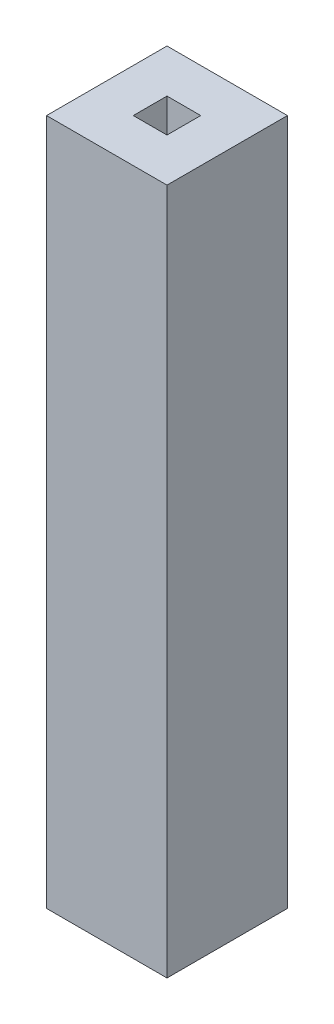
ISO-10303-21;
HEADER;
FILE_DESCRIPTION(('STEP AP214'),'2;1');
FILE_NAME('part.step','',(''),(''),'','','');
FILE_SCHEMA(('AUTOMOTIVE_DESIGN { 1 0 10303 214 1 1 1 1 }'));
ENDSEC;
DATA;
#1=APPLICATION_CONTEXT('core data for automotive mechanical design processes');
#2=APPLICATION_PROTOCOL_DEFINITION('international standard','automotive_design',2000,#1);
#3=PRODUCT_CONTEXT('',#1,'mechanical');
#4=PRODUCT('Part','Part','',(#3));
#5=PRODUCT_RELATED_PRODUCT_CATEGORY('part','',(#4));
#6=PRODUCT_DEFINITION_FORMATION('','',#4);
#7=PRODUCT_DEFINITION_CONTEXT('part definition',#1,'design');
#8=PRODUCT_DEFINITION('design','',#6,#7);
#9=PRODUCT_DEFINITION_SHAPE('','',#8);
#10=(LENGTH_UNIT() NAMED_UNIT(*) SI_UNIT(.MILLI.,.METRE.));
#11=(NAMED_UNIT(*) PLANE_ANGLE_UNIT() SI_UNIT($,.RADIAN.));
#12=(NAMED_UNIT(*) SI_UNIT($,.STERADIAN.) SOLID_ANGLE_UNIT());
#13=UNCERTAINTY_MEASURE_WITH_UNIT(LENGTH_MEASURE(1.E-05),#10,'distance_accuracy_value','');
#14=(GEOMETRIC_REPRESENTATION_CONTEXT(3) GLOBAL_UNCERTAINTY_ASSIGNED_CONTEXT((#13)) GLOBAL_UNIT_ASSIGNED_CONTEXT((#10,
#11,#12)) REPRESENTATION_CONTEXT('',''));
#15=CARTESIAN_POINT('',(0.,0.,0.));
#16=DIRECTION('',(0.,0.,1.));
#17=DIRECTION('',(1.,0.,0.));
#18=AXIS2_PLACEMENT_3D('',#15,#16,#17);
#19=CARTESIAN_POINT('',(0.,14.25,0.));
#20=DIRECTION('',(0.,1.,0.));
#21=DIRECTION('',(0.,0.,1.));
#22=AXIS2_PLACEMENT_3D('',#19,#20,#21);
#23=PLANE('',#22);
#24=DIRECTION('',(0.,0.,-1.));
#25=VECTOR('',#24,1.);
#26=CARTESIAN_POINT('',(1.25,14.25,-1.25));
#27=LINE('',#26,#25);
#28=CARTESIAN_POINT('',(1.25,14.25,1.25));
#29=VERTEX_POINT('',#28);
#30=CARTESIAN_POINT('',(1.25,14.25,-1.25));
#31=VERTEX_POINT('',#30);
#32=EDGE_CURVE('E158',#29,#31,#27,.T.);
#33=ORIENTED_EDGE('',*,*,#32,.T.);
#34=DIRECTION('',(-1.,0.,0.));
#35=VECTOR('',#34,1.);
#36=CARTESIAN_POINT('',(-1.25,14.25,-1.25));
#37=LINE('',#36,#35);
#38=CARTESIAN_POINT('',(-1.25,14.25,-1.25));
#39=VERTEX_POINT('',#38);
#40=EDGE_CURVE('E161',#31,#39,#37,.T.);
#41=ORIENTED_EDGE('',*,*,#40,.T.);
#42=DIRECTION('',(0.,0.,1.));
#43=VECTOR('',#42,1.);
#44=CARTESIAN_POINT('',(-1.25,14.25,-1.25));
#45=LINE('',#44,#43);
#46=CARTESIAN_POINT('',(-1.25,14.25,1.25));
#47=VERTEX_POINT('',#46);
#48=EDGE_CURVE('E164',#39,#47,#45,.T.);
#49=ORIENTED_EDGE('',*,*,#48,.T.);
#50=DIRECTION('',(1.,0.,0.));
#51=VECTOR('',#50,1.);
#52=CARTESIAN_POINT('',(-1.25,14.25,1.25));
#53=LINE('',#52,#51);
#54=EDGE_CURVE('E166',#47,#29,#53,.T.);
#55=ORIENTED_EDGE('',*,*,#54,.T.);
#56=EDGE_LOOP('',(#33,#41,#49,#55));
#57=FACE_BOUND('',#56,.T.);
#58=DIRECTION('',(-1.,0.,0.));
#59=VECTOR('',#58,1.);
#60=CARTESIAN_POINT('',(-1.25,14.25,-0.350000000000001));
#61=LINE('',#60,#59);
#62=CARTESIAN_POINT('',(0.35,14.25,-0.350000000000001));
#63=VERTEX_POINT('',#62);
#64=CARTESIAN_POINT('',(-0.35,14.25,-0.350000000000001));
#65=VERTEX_POINT('',#64);
#66=EDGE_CURVE('E130',#63,#65,#61,.T.);
#67=ORIENTED_EDGE('',*,*,#66,.F.);
#68=DIRECTION('',(0.,0.,-1.));
#69=VECTOR('',#68,1.);
#70=CARTESIAN_POINT('',(0.35,14.25,-1.25));
#71=LINE('',#70,#69);
#72=CARTESIAN_POINT('',(0.35,14.25,0.349999999999999));
#73=VERTEX_POINT('',#72);
#74=EDGE_CURVE('E122',#73,#63,#71,.T.);
#75=ORIENTED_EDGE('',*,*,#74,.F.);
#76=DIRECTION('',(1.,0.,0.));
#77=VECTOR('',#76,1.);
#78=CARTESIAN_POINT('',(-1.25,14.25,0.349999999999999));
#79=LINE('',#78,#77);
#80=CARTESIAN_POINT('',(-0.35,14.25,0.349999999999999));
#81=VERTEX_POINT('',#80);
#82=EDGE_CURVE('E144',#81,#73,#79,.T.);
#83=ORIENTED_EDGE('',*,*,#82,.F.);
#84=DIRECTION('',(0.,0.,1.));
#85=VECTOR('',#84,1.);
#86=CARTESIAN_POINT('',(-0.35,14.25,-1.25));
#87=LINE('',#86,#85);
#88=EDGE_CURVE('E142',#65,#81,#87,.T.);
#89=ORIENTED_EDGE('',*,*,#88,.F.);
#90=EDGE_LOOP('',(#67,#75,#83,#89));
#91=FACE_BOUND('',#90,.T.);
#92=ADVANCED_FACE('F57',(#57,#91),#23,.T.);
#93=CARTESIAN_POINT('',(0.,0.,0.));
#94=DIRECTION('',(0.,1.,0.));
#95=DIRECTION('',(0.,0.,1.));
#96=AXIS2_PLACEMENT_3D('',#93,#94,#95);
#97=PLANE('',#96);
#98=DIRECTION('',(0.,0.,-1.));
#99=VECTOR('',#98,1.);
#100=CARTESIAN_POINT('',(1.25,0.,-1.25));
#101=LINE('',#100,#99);
#102=CARTESIAN_POINT('',(1.25,0.,1.25));
#103=VERTEX_POINT('',#102);
#104=CARTESIAN_POINT('',(1.25,0.,-1.25));
#105=VERTEX_POINT('',#104);
#106=EDGE_CURVE('E138',#103,#105,#101,.T.);
#107=ORIENTED_EDGE('',*,*,#106,.F.);
#108=DIRECTION('',(1.,0.,0.));
#109=VECTOR('',#108,1.);
#110=CARTESIAN_POINT('',(-1.25,0.,1.25));
#111=LINE('',#110,#109);
#112=CARTESIAN_POINT('',(-1.25,0.,1.25));
#113=VERTEX_POINT('',#112);
#114=EDGE_CURVE('E162',#113,#103,#111,.T.);
#115=ORIENTED_EDGE('',*,*,#114,.F.);
#116=DIRECTION('',(0.,0.,1.));
#117=VECTOR('',#116,1.);
#118=CARTESIAN_POINT('',(-1.25,0.,-1.25));
#119=LINE('',#118,#117);
#120=CARTESIAN_POINT('',(-1.25,0.,-1.25));
#121=VERTEX_POINT('',#120);
#122=EDGE_CURVE('E173',#121,#113,#119,.T.);
#123=ORIENTED_EDGE('',*,*,#122,.F.);
#124=DIRECTION('',(-1.,0.,0.));
#125=VECTOR('',#124,1.);
#126=CARTESIAN_POINT('',(-1.25,0.,-1.25));
#127=LINE('',#126,#125);
#128=EDGE_CURVE('E171',#105,#121,#127,.T.);
#129=ORIENTED_EDGE('',*,*,#128,.F.);
#130=EDGE_LOOP('',(#107,#115,#123,#129));
#131=FACE_BOUND('',#130,.T.);
#132=DIRECTION('',(0.,0.,-1.));
#133=VECTOR('',#132,1.);
#134=CARTESIAN_POINT('',(0.35,0.,-1.25));
#135=LINE('',#134,#133);
#136=CARTESIAN_POINT('',(0.35,0.,0.349999999999999));
#137=VERTEX_POINT('',#136);
#138=CARTESIAN_POINT('',(0.35,0.,-0.350000000000001));
#139=VERTEX_POINT('',#138);
#140=EDGE_CURVE('E80',#137,#139,#135,.T.);
#141=ORIENTED_EDGE('',*,*,#140,.T.);
#142=DIRECTION('',(-1.,0.,0.));
#143=VECTOR('',#142,1.);
#144=CARTESIAN_POINT('',(-1.25,0.,-0.350000000000001));
#145=LINE('',#144,#143);
#146=CARTESIAN_POINT('',(-0.35,0.,-0.350000000000001));
#147=VERTEX_POINT('',#146);
#148=EDGE_CURVE('E137',#139,#147,#145,.T.);
#149=ORIENTED_EDGE('',*,*,#148,.T.);
#150=DIRECTION('',(0.,0.,1.));
#151=VECTOR('',#150,1.);
#152=CARTESIAN_POINT('',(-0.35,0.,-1.25));
#153=LINE('',#152,#151);
#154=CARTESIAN_POINT('',(-0.35,0.,0.349999999999999));
#155=VERTEX_POINT('',#154);
#156=EDGE_CURVE('E150',#147,#155,#153,.T.);
#157=ORIENTED_EDGE('',*,*,#156,.T.);
#158=DIRECTION('',(1.,0.,0.));
#159=VECTOR('',#158,1.);
#160=CARTESIAN_POINT('',(-1.25,0.,0.349999999999999));
#161=LINE('',#160,#159);
#162=EDGE_CURVE('E131',#155,#137,#161,.T.);
#163=ORIENTED_EDGE('',*,*,#162,.T.);
#164=EDGE_LOOP('',(#141,#149,#157,#163));
#165=FACE_BOUND('',#164,.T.);
#166=ADVANCED_FACE('F191',(#131,#165),#97,.F.);
#167=CARTESIAN_POINT('',(1.25,14.25,-1.25));
#168=DIRECTION('',(-1.,0.,0.));
#169=DIRECTION('',(0.,0.,1.));
#170=AXIS2_PLACEMENT_3D('',#167,#168,#169);
#171=PLANE('',#170);
#172=ORIENTED_EDGE('',*,*,#106,.T.);
#173=DIRECTION('',(0.,-1.,0.));
#174=VECTOR('',#173,1.);
#175=CARTESIAN_POINT('',(1.25,14.25,-1.25));
#176=LINE('',#175,#174);
#177=EDGE_CURVE('E12',#31,#105,#176,.T.);
#178=ORIENTED_EDGE('',*,*,#177,.F.);
#179=ORIENTED_EDGE('',*,*,#32,.F.);
#180=DIRECTION('',(0.,-1.,0.));
#181=VECTOR('',#180,1.);
#182=CARTESIAN_POINT('',(1.25,14.25,1.25));
#183=LINE('',#182,#181);
#184=EDGE_CURVE('E168',#29,#103,#183,.T.);
#185=ORIENTED_EDGE('',*,*,#184,.T.);
#186=EDGE_LOOP('',(#172,#178,#179,#185));
#187=FACE_BOUND('',#186,.T.);
#188=ADVANCED_FACE('F59',(#187),#171,.F.);
#189=CARTESIAN_POINT('',(-1.25,14.25,-1.25));
#190=DIRECTION('',(0.,0.,1.));
#191=DIRECTION('',(1.,0.,0.));
#192=AXIS2_PLACEMENT_3D('',#189,#190,#191);
#193=PLANE('',#192);
#194=ORIENTED_EDGE('',*,*,#128,.T.);
#195=DIRECTION('',(0.,-1.,0.));
#196=VECTOR('',#195,1.);
#197=CARTESIAN_POINT('',(-1.25,14.25,-1.25));
#198=LINE('',#197,#196);
#199=EDGE_CURVE('E65',#39,#121,#198,.T.);
#200=ORIENTED_EDGE('',*,*,#199,.F.);
#201=ORIENTED_EDGE('',*,*,#40,.F.);
#202=ORIENTED_EDGE('',*,*,#177,.T.);
#203=EDGE_LOOP('',(#194,#200,#201,#202));
#204=FACE_BOUND('',#203,.T.);
#205=ADVANCED_FACE('F201',(#204),#193,.F.);
#206=CARTESIAN_POINT('',(-1.25,14.25,-1.25));
#207=DIRECTION('',(1.,0.,0.));
#208=DIRECTION('',(0.,0.,-1.));
#209=AXIS2_PLACEMENT_3D('',#206,#207,#208);
#210=PLANE('',#209);
#211=ORIENTED_EDGE('',*,*,#122,.T.);
#212=DIRECTION('',(0.,-1.,0.));
#213=VECTOR('',#212,1.);
#214=CARTESIAN_POINT('',(-1.25,14.25,1.25));
#215=LINE('',#214,#213);
#216=EDGE_CURVE('E178',#47,#113,#215,.T.);
#217=ORIENTED_EDGE('',*,*,#216,.F.);
#218=ORIENTED_EDGE('',*,*,#48,.F.);
#219=ORIENTED_EDGE('',*,*,#199,.T.);
#220=EDGE_LOOP('',(#211,#217,#218,#219));
#221=FACE_BOUND('',#220,.T.);
#222=ADVANCED_FACE('F185',(#221),#210,.F.);
#223=CARTESIAN_POINT('',(-1.25,14.25,1.25));
#224=DIRECTION('',(0.,0.,-1.));
#225=DIRECTION('',(-1.,0.,0.));
#226=AXIS2_PLACEMENT_3D('',#223,#224,#225);
#227=PLANE('',#226);
#228=ORIENTED_EDGE('',*,*,#114,.T.);
#229=ORIENTED_EDGE('',*,*,#184,.F.);
#230=ORIENTED_EDGE('',*,*,#54,.F.);
#231=ORIENTED_EDGE('',*,*,#216,.T.);
#232=EDGE_LOOP('',(#228,#229,#230,#231));
#233=FACE_BOUND('',#232,.T.);
#234=ADVANCED_FACE('F195',(#233),#227,.F.);
#235=CARTESIAN_POINT('',(0.35,14.25,-1.25));
#236=DIRECTION('',(-1.,0.,0.));
#237=DIRECTION('',(0.,0.,1.));
#238=AXIS2_PLACEMENT_3D('',#235,#236,#237);
#239=PLANE('',#238);
#240=ORIENTED_EDGE('',*,*,#140,.F.);
#241=DIRECTION('',(0.,-1.,0.));
#242=VECTOR('',#241,1.);
#243=CARTESIAN_POINT('',(0.35,14.25,0.349999999999999));
#244=LINE('',#243,#242);
#245=EDGE_CURVE('E126',#73,#137,#244,.T.);
#246=ORIENTED_EDGE('',*,*,#245,.F.);
#247=ORIENTED_EDGE('',*,*,#74,.T.);
#248=DIRECTION('',(0.,-1.,0.));
#249=VECTOR('',#248,1.);
#250=CARTESIAN_POINT('',(0.35,14.25,-0.350000000000001));
#251=LINE('',#250,#249);
#252=EDGE_CURVE('E125',#63,#139,#251,.T.);
#253=ORIENTED_EDGE('',*,*,#252,.T.);
#254=EDGE_LOOP('',(#240,#246,#247,#253));
#255=FACE_BOUND('',#254,.T.);
#256=ADVANCED_FACE('F124',(#255),#239,.T.);
#257=CARTESIAN_POINT('',(-1.25,14.25,-0.350000000000001));
#258=DIRECTION('',(0.,0.,1.));
#259=DIRECTION('',(1.,0.,0.));
#260=AXIS2_PLACEMENT_3D('',#257,#258,#259);
#261=PLANE('',#260);
#262=ORIENTED_EDGE('',*,*,#148,.F.);
#263=ORIENTED_EDGE('',*,*,#252,.F.);
#264=ORIENTED_EDGE('',*,*,#66,.T.);
#265=DIRECTION('',(0.,-1.,0.));
#266=VECTOR('',#265,1.);
#267=CARTESIAN_POINT('',(-0.35,14.25,-0.350000000000001));
#268=LINE('',#267,#266);
#269=EDGE_CURVE('E139',#65,#147,#268,.T.);
#270=ORIENTED_EDGE('',*,*,#269,.T.);
#271=EDGE_LOOP('',(#262,#263,#264,#270));
#272=FACE_BOUND('',#271,.T.);
#273=ADVANCED_FACE('F134',(#272),#261,.T.);
#274=CARTESIAN_POINT('',(-0.35,14.25,-1.25));
#275=DIRECTION('',(1.,0.,0.));
#276=DIRECTION('',(0.,0.,-1.));
#277=AXIS2_PLACEMENT_3D('',#274,#275,#276);
#278=PLANE('',#277);
#279=ORIENTED_EDGE('',*,*,#156,.F.);
#280=ORIENTED_EDGE('',*,*,#269,.F.);
#281=ORIENTED_EDGE('',*,*,#88,.T.);
#282=DIRECTION('',(0.,-1.,0.));
#283=VECTOR('',#282,1.);
#284=CARTESIAN_POINT('',(-0.35,14.25,0.349999999999999));
#285=LINE('',#284,#283);
#286=EDGE_CURVE('E72',#81,#155,#285,.T.);
#287=ORIENTED_EDGE('',*,*,#286,.T.);
#288=EDGE_LOOP('',(#279,#280,#281,#287));
#289=FACE_BOUND('',#288,.T.);
#290=ADVANCED_FACE('F224',(#289),#278,.T.);
#291=CARTESIAN_POINT('',(-1.25,14.25,0.349999999999999));
#292=DIRECTION('',(0.,0.,-1.));
#293=DIRECTION('',(-1.,0.,0.));
#294=AXIS2_PLACEMENT_3D('',#291,#292,#293);
#295=PLANE('',#294);
#296=ORIENTED_EDGE('',*,*,#162,.F.);
#297=ORIENTED_EDGE('',*,*,#286,.F.);
#298=ORIENTED_EDGE('',*,*,#82,.T.);
#299=ORIENTED_EDGE('',*,*,#245,.T.);
#300=EDGE_LOOP('',(#296,#297,#298,#299));
#301=FACE_BOUND('',#300,.T.);
#302=ADVANCED_FACE('F228',(#301),#295,.T.);
#303=CLOSED_SHELL('',(#92,#166,#188,#205,#222,#234,#256,#273,#290,#302));
#304=MANIFOLD_SOLID_BREP('B2',#303);
#305=ADVANCED_BREP_SHAPE_REPRESENTATION('',(#18,#304),#14);
#306=SHAPE_DEFINITION_REPRESENTATION(#9,#305);
ENDSEC;
END-ISO-10303-21;
